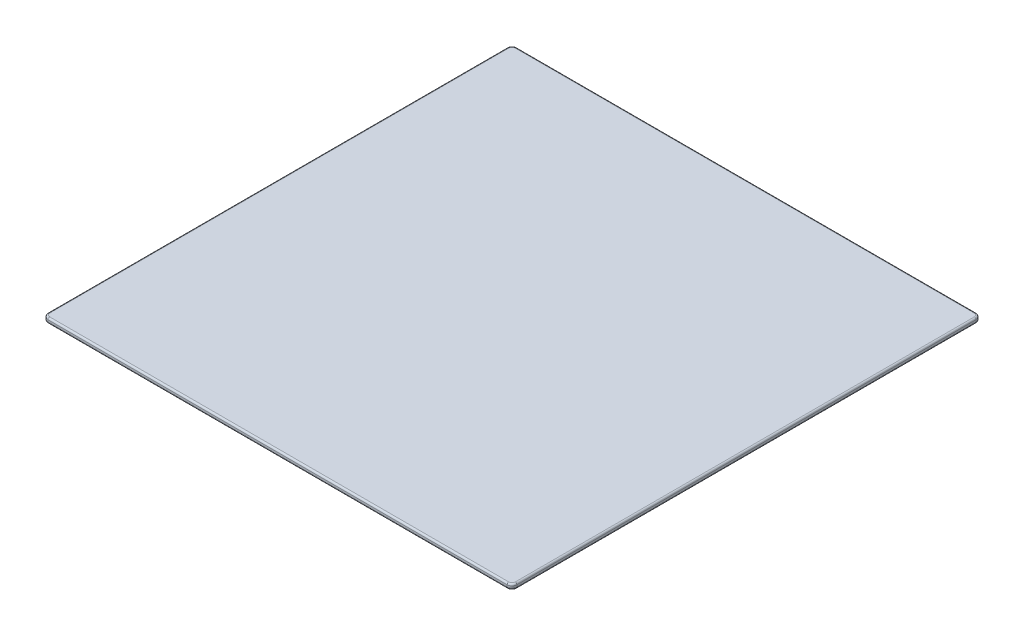
ISO-10303-21;
HEADER;
FILE_DESCRIPTION(('STEP AP214'),'2;1');
FILE_NAME('part.step','',(''),(''),'','','');
FILE_SCHEMA(('AUTOMOTIVE_DESIGN { 1 0 10303 214 1 1 1 1 }'));
ENDSEC;
DATA;
#1=APPLICATION_CONTEXT('core data for automotive mechanical design processes');
#2=APPLICATION_PROTOCOL_DEFINITION('international standard','automotive_design',2000,#1);
#3=PRODUCT_CONTEXT('',#1,'mechanical');
#4=PRODUCT('Part','Part','',(#3));
#5=PRODUCT_RELATED_PRODUCT_CATEGORY('part','',(#4));
#6=PRODUCT_DEFINITION_FORMATION('','',#4);
#7=PRODUCT_DEFINITION_CONTEXT('part definition',#1,'design');
#8=PRODUCT_DEFINITION('design','',#6,#7);
#9=PRODUCT_DEFINITION_SHAPE('','',#8);
#10=(LENGTH_UNIT() NAMED_UNIT(*) SI_UNIT(.MILLI.,.METRE.));
#11=(NAMED_UNIT(*) PLANE_ANGLE_UNIT() SI_UNIT($,.RADIAN.));
#12=(NAMED_UNIT(*) SI_UNIT($,.STERADIAN.) SOLID_ANGLE_UNIT());
#13=UNCERTAINTY_MEASURE_WITH_UNIT(LENGTH_MEASURE(1.E-05),#10,'distance_accuracy_value','');
#14=(GEOMETRIC_REPRESENTATION_CONTEXT(3) GLOBAL_UNCERTAINTY_ASSIGNED_CONTEXT((#13)) GLOBAL_UNIT_ASSIGNED_CONTEXT((#10,
#11,#12)) REPRESENTATION_CONTEXT('',''));
#15=CARTESIAN_POINT('',(0.,0.,0.));
#16=DIRECTION('',(0.,0.,1.));
#17=DIRECTION('',(1.,0.,0.));
#18=AXIS2_PLACEMENT_3D('',#15,#16,#17);
#19=CARTESIAN_POINT('',(142.875,3.175,142.875));
#20=DIRECTION('',(-1.,0.,0.));
#21=DIRECTION('',(0.,0.,1.));
#22=AXIS2_PLACEMENT_3D('',#19,#20,#21);
#23=PLANE('',#22);
#24=DIRECTION('',(0.,-1.,0.));
#25=VECTOR('',#24,1.);
#26=CARTESIAN_POINT('',(142.875,3.175,139.875));
#27=LINE('',#26,#25);
#28=CARTESIAN_POINT('',(142.875,2.175,139.875));
#29=VERTEX_POINT('',#28);
#30=CARTESIAN_POINT('',(142.875,1.,139.875));
#31=VERTEX_POINT('',#30);
#32=EDGE_CURVE('E282',#29,#31,#27,.T.);
#33=ORIENTED_EDGE('',*,*,#32,.T.);
#34=DIRECTION('',(0.,0.,-1.));
#35=VECTOR('',#34,1.);
#36=CARTESIAN_POINT('',(142.875,1.,-139.875));
#37=LINE('',#36,#35);
#38=CARTESIAN_POINT('',(142.875,1.,-139.875));
#39=VERTEX_POINT('',#38);
#40=EDGE_CURVE('E59',#31,#39,#37,.T.);
#41=ORIENTED_EDGE('',*,*,#40,.T.);
#42=DIRECTION('',(0.,-1.,0.));
#43=VECTOR('',#42,1.);
#44=CARTESIAN_POINT('',(142.875,3.175,-139.875));
#45=LINE('',#44,#43);
#46=CARTESIAN_POINT('',(142.875,2.175,-139.875));
#47=VERTEX_POINT('',#46);
#48=EDGE_CURVE('E286',#39,#47,#45,.F.);
#49=ORIENTED_EDGE('',*,*,#48,.T.);
#50=DIRECTION('',(0.,0.,-1.));
#51=VECTOR('',#50,1.);
#52=CARTESIAN_POINT('',(142.875,2.175,142.875));
#53=LINE('',#52,#51);
#54=EDGE_CURVE('E188',#47,#29,#53,.F.);
#55=ORIENTED_EDGE('',*,*,#54,.T.);
#56=EDGE_LOOP('',(#33,#41,#49,#55));
#57=FACE_BOUND('',#56,.T.);
#58=ADVANCED_FACE('F35',(#57),#23,.F.);
#59=CARTESIAN_POINT('',(-142.875,3.175,-142.875));
#60=DIRECTION('',(0.,0.,1.));
#61=DIRECTION('',(1.,0.,0.));
#62=AXIS2_PLACEMENT_3D('',#59,#60,#61);
#63=PLANE('',#62);
#64=DIRECTION('',(0.,-1.,0.));
#65=VECTOR('',#64,1.);
#66=CARTESIAN_POINT('',(139.875,3.175,-142.875));
#67=LINE('',#66,#65);
#68=CARTESIAN_POINT('',(139.875,2.175,-142.875));
#69=VERTEX_POINT('',#68);
#70=CARTESIAN_POINT('',(139.875,1.,-142.875));
#71=VERTEX_POINT('',#70);
#72=EDGE_CURVE('E287',#69,#71,#67,.T.);
#73=ORIENTED_EDGE('',*,*,#72,.T.);
#74=DIRECTION('',(-1.,0.,0.));
#75=VECTOR('',#74,1.);
#76=CARTESIAN_POINT('',(-139.875,1.,-142.875));
#77=LINE('',#76,#75);
#78=CARTESIAN_POINT('',(-139.875,1.,-142.875));
#79=VERTEX_POINT('',#78);
#80=EDGE_CURVE('E11',#71,#79,#77,.T.);
#81=ORIENTED_EDGE('',*,*,#80,.T.);
#82=DIRECTION('',(0.,-1.,0.));
#83=VECTOR('',#82,1.);
#84=CARTESIAN_POINT('',(-139.875,3.175,-142.875));
#85=LINE('',#84,#83);
#86=CARTESIAN_POINT('',(-139.875,2.175,-142.875));
#87=VERTEX_POINT('',#86);
#88=EDGE_CURVE('E218',#79,#87,#85,.F.);
#89=ORIENTED_EDGE('',*,*,#88,.T.);
#90=DIRECTION('',(-1.,0.,0.));
#91=VECTOR('',#90,1.);
#92=CARTESIAN_POINT('',(-142.875,2.175,-142.875));
#93=LINE('',#92,#91);
#94=EDGE_CURVE('E178',#87,#69,#93,.F.);
#95=ORIENTED_EDGE('',*,*,#94,.T.);
#96=EDGE_LOOP('',(#73,#81,#89,#95));
#97=FACE_BOUND('',#96,.T.);
#98=ADVANCED_FACE('F355',(#97),#63,.F.);
#99=CARTESIAN_POINT('',(-142.875,3.175,142.875));
#100=DIRECTION('',(1.,0.,0.));
#101=DIRECTION('',(0.,0.,-1.));
#102=AXIS2_PLACEMENT_3D('',#99,#100,#101);
#103=PLANE('',#102);
#104=DIRECTION('',(0.,-1.,0.));
#105=VECTOR('',#104,1.);
#106=CARTESIAN_POINT('',(-142.875,3.175,-139.875));
#107=LINE('',#106,#105);
#108=CARTESIAN_POINT('',(-142.875,2.175,-139.875));
#109=VERTEX_POINT('',#108);
#110=CARTESIAN_POINT('',(-142.875,1.,-139.875));
#111=VERTEX_POINT('',#110);
#112=EDGE_CURVE('E297',#109,#111,#107,.T.);
#113=ORIENTED_EDGE('',*,*,#112,.T.);
#114=DIRECTION('',(0.,0.,1.));
#115=VECTOR('',#114,1.);
#116=CARTESIAN_POINT('',(-142.875,1.,139.875));
#117=LINE('',#116,#115);
#118=CARTESIAN_POINT('',(-142.875,1.,139.875));
#119=VERTEX_POINT('',#118);
#120=EDGE_CURVE('E238',#111,#119,#117,.T.);
#121=ORIENTED_EDGE('',*,*,#120,.T.);
#122=DIRECTION('',(0.,-1.,0.));
#123=VECTOR('',#122,1.);
#124=CARTESIAN_POINT('',(-142.875,3.175,139.875));
#125=LINE('',#124,#123);
#126=CARTESIAN_POINT('',(-142.875,2.175,139.875));
#127=VERTEX_POINT('',#126);
#128=EDGE_CURVE('E171',#119,#127,#125,.F.);
#129=ORIENTED_EDGE('',*,*,#128,.T.);
#130=DIRECTION('',(0.,0.,1.));
#131=VECTOR('',#130,1.);
#132=CARTESIAN_POINT('',(-142.875,2.175,142.875));
#133=LINE('',#132,#131);
#134=EDGE_CURVE('E198',#127,#109,#133,.F.);
#135=ORIENTED_EDGE('',*,*,#134,.T.);
#136=EDGE_LOOP('',(#113,#121,#129,#135));
#137=FACE_BOUND('',#136,.T.);
#138=ADVANCED_FACE('F324',(#137),#103,.F.);
#139=CARTESIAN_POINT('',(-142.875,3.175,142.875));
#140=DIRECTION('',(0.,0.,-1.));
#141=DIRECTION('',(-1.,0.,0.));
#142=AXIS2_PLACEMENT_3D('',#139,#140,#141);
#143=PLANE('',#142);
#144=DIRECTION('',(0.,-1.,0.));
#145=VECTOR('',#144,1.);
#146=CARTESIAN_POINT('',(-139.875,3.175,142.875));
#147=LINE('',#146,#145);
#148=CARTESIAN_POINT('',(-139.875,2.175,142.875));
#149=VERTEX_POINT('',#148);
#150=CARTESIAN_POINT('',(-139.875,1.,142.875));
#151=VERTEX_POINT('',#150);
#152=EDGE_CURVE('E289',#149,#151,#147,.T.);
#153=ORIENTED_EDGE('',*,*,#152,.T.);
#154=DIRECTION('',(1.,0.,0.));
#155=VECTOR('',#154,1.);
#156=CARTESIAN_POINT('',(139.875,1.,142.875));
#157=LINE('',#156,#155);
#158=CARTESIAN_POINT('',(139.875,1.,142.875));
#159=VERTEX_POINT('',#158);
#160=EDGE_CURVE('E242',#151,#159,#157,.T.);
#161=ORIENTED_EDGE('',*,*,#160,.T.);
#162=DIRECTION('',(0.,-1.,0.));
#163=VECTOR('',#162,1.);
#164=CARTESIAN_POINT('',(139.875,3.175,142.875));
#165=LINE('',#164,#163);
#166=CARTESIAN_POINT('',(139.875,2.175,142.875));
#167=VERTEX_POINT('',#166);
#168=EDGE_CURVE('E284',#159,#167,#165,.F.);
#169=ORIENTED_EDGE('',*,*,#168,.T.);
#170=DIRECTION('',(1.,0.,0.));
#171=VECTOR('',#170,1.);
#172=CARTESIAN_POINT('',(-142.875,2.175,142.875));
#173=LINE('',#172,#171);
#174=EDGE_CURVE('E193',#167,#149,#173,.F.);
#175=ORIENTED_EDGE('',*,*,#174,.T.);
#176=EDGE_LOOP('',(#153,#161,#169,#175));
#177=FACE_BOUND('',#176,.T.);
#178=ADVANCED_FACE('F551',(#177),#143,.F.);
#179=CARTESIAN_POINT('',(0.,3.175,0.));
#180=DIRECTION('',(0.,-1.,0.));
#181=DIRECTION('',(0.,0.,-1.));
#182=AXIS2_PLACEMENT_3D('',#179,#180,#181);
#183=PLANE('',#182);
#184=DIRECTION('',(-1.,0.,0.));
#185=VECTOR('',#184,1.);
#186=CARTESIAN_POINT('',(0.,3.175,-141.875));
#187=LINE('',#186,#185);
#188=CARTESIAN_POINT('',(139.875,3.175,-141.875));
#189=VERTEX_POINT('',#188);
#190=CARTESIAN_POINT('',(-139.875,3.175,-141.875));
#191=VERTEX_POINT('',#190);
#192=EDGE_CURVE('E175',#189,#191,#187,.T.);
#193=ORIENTED_EDGE('',*,*,#192,.T.);
#194=CARTESIAN_POINT('',(-139.875,3.175,-139.875));
#195=DIRECTION('',(0.,-1.,0.));
#196=DIRECTION('',(0.,0.,-1.));
#197=AXIS2_PLACEMENT_3D('',#194,#195,#196);
#198=CIRCLE('',#197,2.);
#199=CARTESIAN_POINT('',(-141.875,3.175,-139.875));
#200=VERTEX_POINT('',#199);
#201=EDGE_CURVE('E156',#191,#200,#198,.F.);
#202=ORIENTED_EDGE('',*,*,#201,.T.);
#203=DIRECTION('',(0.,0.,1.));
#204=VECTOR('',#203,1.);
#205=CARTESIAN_POINT('',(-141.875,3.175,0.));
#206=LINE('',#205,#204);
#207=CARTESIAN_POINT('',(-141.875,3.175,139.875));
#208=VERTEX_POINT('',#207);
#209=EDGE_CURVE('E164',#200,#208,#206,.T.);
#210=ORIENTED_EDGE('',*,*,#209,.T.);
#211=CARTESIAN_POINT('',(-139.875,3.175,139.875));
#212=DIRECTION('',(0.,-1.,0.));
#213=DIRECTION('',(0.,0.,-1.));
#214=AXIS2_PLACEMENT_3D('',#211,#212,#213);
#215=CIRCLE('',#214,2.);
#216=CARTESIAN_POINT('',(-139.875,3.175,141.875));
#217=VERTEX_POINT('',#216);
#218=EDGE_CURVE('E170',#208,#217,#215,.F.);
#219=ORIENTED_EDGE('',*,*,#218,.T.);
#220=DIRECTION('',(1.,0.,0.));
#221=VECTOR('',#220,1.);
#222=CARTESIAN_POINT('',(0.,3.175,141.875));
#223=LINE('',#222,#221);
#224=CARTESIAN_POINT('',(139.875,3.175,141.875));
#225=VERTEX_POINT('',#224);
#226=EDGE_CURVE('E302',#217,#225,#223,.T.);
#227=ORIENTED_EDGE('',*,*,#226,.T.);
#228=CARTESIAN_POINT('',(139.875,3.175,139.875));
#229=DIRECTION('',(0.,-1.,0.));
#230=DIRECTION('',(0.,0.,-1.));
#231=AXIS2_PLACEMENT_3D('',#228,#229,#230);
#232=CIRCLE('',#231,2.);
#233=CARTESIAN_POINT('',(141.875,3.175,139.875));
#234=VERTEX_POINT('',#233);
#235=EDGE_CURVE('E304',#225,#234,#232,.F.);
#236=ORIENTED_EDGE('',*,*,#235,.T.);
#237=DIRECTION('',(0.,0.,-1.));
#238=VECTOR('',#237,1.);
#239=CARTESIAN_POINT('',(141.875,3.175,0.));
#240=LINE('',#239,#238);
#241=CARTESIAN_POINT('',(141.875,3.175,-139.875));
#242=VERTEX_POINT('',#241);
#243=EDGE_CURVE('E306',#234,#242,#240,.T.);
#244=ORIENTED_EDGE('',*,*,#243,.T.);
#245=CARTESIAN_POINT('',(139.875,3.175,-139.875));
#246=DIRECTION('',(0.,-1.,0.));
#247=DIRECTION('',(0.,0.,-1.));
#248=AXIS2_PLACEMENT_3D('',#245,#246,#247);
#249=CIRCLE('',#248,2.);
#250=EDGE_CURVE('E180',#242,#189,#249,.F.);
#251=ORIENTED_EDGE('',*,*,#250,.T.);
#252=EDGE_LOOP('',(#193,#202,#210,#219,#227,#236,#244,#251));
#253=FACE_BOUND('',#252,.T.);
#254=ADVANCED_FACE('F173',(#253),#183,.F.);
#255=CARTESIAN_POINT('',(0.,0.,0.));
#256=DIRECTION('',(0.,-1.,0.));
#257=DIRECTION('',(0.,0.,-1.));
#258=AXIS2_PLACEMENT_3D('',#255,#256,#257);
#259=PLANE('',#258);
#260=DIRECTION('',(0.,0.,1.));
#261=VECTOR('',#260,1.);
#262=CARTESIAN_POINT('',(-141.875,0.,-139.875));
#263=LINE('',#262,#261);
#264=CARTESIAN_POINT('',(-141.875,0.,139.875));
#265=VERTEX_POINT('',#264);
#266=CARTESIAN_POINT('',(-141.875,0.,-139.875));
#267=VERTEX_POINT('',#266);
#268=EDGE_CURVE('E230',#265,#267,#263,.F.);
#269=ORIENTED_EDGE('',*,*,#268,.T.);
#270=CARTESIAN_POINT('',(-139.875,0.,-139.875));
#271=DIRECTION('',(0.,-1.,0.));
#272=DIRECTION('',(0.,0.,-1.));
#273=AXIS2_PLACEMENT_3D('',#270,#271,#272);
#274=CIRCLE('',#273,2.);
#275=CARTESIAN_POINT('',(-139.875,0.,-141.875));
#276=VERTEX_POINT('',#275);
#277=EDGE_CURVE('E232',#267,#276,#274,.T.);
#278=ORIENTED_EDGE('',*,*,#277,.T.);
#279=DIRECTION('',(-1.,0.,0.));
#280=VECTOR('',#279,1.);
#281=CARTESIAN_POINT('',(139.875,0.,-141.875));
#282=LINE('',#281,#280);
#283=CARTESIAN_POINT('',(139.875,0.,-141.875));
#284=VERTEX_POINT('',#283);
#285=EDGE_CURVE('E199',#276,#284,#282,.F.);
#286=ORIENTED_EDGE('',*,*,#285,.T.);
#287=CARTESIAN_POINT('',(139.875,0.,-139.875));
#288=DIRECTION('',(0.,-1.,0.));
#289=DIRECTION('',(0.,0.,-1.));
#290=AXIS2_PLACEMENT_3D('',#287,#288,#289);
#291=CIRCLE('',#290,2.);
#292=CARTESIAN_POINT('',(141.875,0.,-139.875));
#293=VERTEX_POINT('',#292);
#294=EDGE_CURVE('E220',#284,#293,#291,.T.);
#295=ORIENTED_EDGE('',*,*,#294,.T.);
#296=DIRECTION('',(0.,0.,-1.));
#297=VECTOR('',#296,1.);
#298=CARTESIAN_POINT('',(141.875,0.,139.875));
#299=LINE('',#298,#297);
#300=CARTESIAN_POINT('',(141.875,0.,139.875));
#301=VERTEX_POINT('',#300);
#302=EDGE_CURVE('E222',#293,#301,#299,.F.);
#303=ORIENTED_EDGE('',*,*,#302,.T.);
#304=CARTESIAN_POINT('',(139.875,0.,139.875));
#305=DIRECTION('',(0.,-1.,0.));
#306=DIRECTION('',(0.,0.,-1.));
#307=AXIS2_PLACEMENT_3D('',#304,#305,#306);
#308=CIRCLE('',#307,2.);
#309=CARTESIAN_POINT('',(139.875,0.,141.875));
#310=VERTEX_POINT('',#309);
#311=EDGE_CURVE('E224',#301,#310,#308,.T.);
#312=ORIENTED_EDGE('',*,*,#311,.T.);
#313=DIRECTION('',(1.,0.,0.));
#314=VECTOR('',#313,1.);
#315=CARTESIAN_POINT('',(-139.875,0.,141.875));
#316=LINE('',#315,#314);
#317=CARTESIAN_POINT('',(-139.875,0.,141.875));
#318=VERTEX_POINT('',#317);
#319=EDGE_CURVE('E226',#310,#318,#316,.F.);
#320=ORIENTED_EDGE('',*,*,#319,.T.);
#321=CARTESIAN_POINT('',(-139.875,0.,139.875));
#322=DIRECTION('',(0.,-1.,0.));
#323=DIRECTION('',(0.,0.,-1.));
#324=AXIS2_PLACEMENT_3D('',#321,#322,#323);
#325=CIRCLE('',#324,2.);
#326=EDGE_CURVE('E228',#318,#265,#325,.T.);
#327=ORIENTED_EDGE('',*,*,#326,.T.);
#328=EDGE_LOOP('',(#269,#278,#286,#295,#303,#312,#320,#327));
#329=FACE_BOUND('',#328,.T.);
#330=ADVANCED_FACE('F366',(#329),#259,.T.);
#331=CARTESIAN_POINT('',(139.875,3.175,-139.875));
#332=DIRECTION('',(0.,-1.,0.));
#333=DIRECTION('',(0.,0.,-1.));
#334=AXIS2_PLACEMENT_3D('',#331,#332,#333);
#335=CYLINDRICAL_SURFACE('',#334,3.);
#336=ORIENTED_EDGE('',*,*,#48,.F.);
#337=CARTESIAN_POINT('',(139.875,1.,-139.875));
#338=DIRECTION('',(0.,-1.,0.));
#339=DIRECTION('',(0.,0.,-1.));
#340=AXIS2_PLACEMENT_3D('',#337,#338,#339);
#341=CIRCLE('',#340,3.);
#342=EDGE_CURVE('E44',#39,#71,#341,.F.);
#343=ORIENTED_EDGE('',*,*,#342,.T.);
#344=ORIENTED_EDGE('',*,*,#72,.F.);
#345=CARTESIAN_POINT('',(139.875,2.175,-139.875));
#346=DIRECTION('',(0.,-1.,0.));
#347=DIRECTION('',(0.,0.,-1.));
#348=AXIS2_PLACEMENT_3D('',#345,#346,#347);
#349=CIRCLE('',#348,3.);
#350=EDGE_CURVE('E185',#69,#47,#349,.T.);
#351=ORIENTED_EDGE('',*,*,#350,.T.);
#352=EDGE_LOOP('',(#336,#343,#344,#351));
#353=FACE_BOUND('',#352,.T.);
#354=ADVANCED_FACE('F363',(#353),#335,.T.);
#355=CARTESIAN_POINT('',(139.875,3.175,139.875));
#356=DIRECTION('',(0.,-1.,0.));
#357=DIRECTION('',(0.,0.,-1.));
#358=AXIS2_PLACEMENT_3D('',#355,#356,#357);
#359=CYLINDRICAL_SURFACE('',#358,3.);
#360=ORIENTED_EDGE('',*,*,#168,.F.);
#361=CARTESIAN_POINT('',(139.875,1.,139.875));
#362=DIRECTION('',(0.,-1.,0.));
#363=DIRECTION('',(0.,0.,-1.));
#364=AXIS2_PLACEMENT_3D('',#361,#362,#363);
#365=CIRCLE('',#364,3.);
#366=EDGE_CURVE('E244',#159,#31,#365,.F.);
#367=ORIENTED_EDGE('',*,*,#366,.T.);
#368=ORIENTED_EDGE('',*,*,#32,.F.);
#369=CARTESIAN_POINT('',(139.875,2.175,139.875));
#370=DIRECTION('',(0.,-1.,0.));
#371=DIRECTION('',(0.,0.,-1.));
#372=AXIS2_PLACEMENT_3D('',#369,#370,#371);
#373=CIRCLE('',#372,3.);
#374=EDGE_CURVE('E190',#29,#167,#373,.T.);
#375=ORIENTED_EDGE('',*,*,#374,.T.);
#376=EDGE_LOOP('',(#360,#367,#368,#375));
#377=FACE_BOUND('',#376,.T.);
#378=ADVANCED_FACE('F281',(#377),#359,.T.);
#379=CARTESIAN_POINT('',(-139.875,3.175,139.875));
#380=DIRECTION('',(0.,-1.,0.));
#381=DIRECTION('',(0.,0.,-1.));
#382=AXIS2_PLACEMENT_3D('',#379,#380,#381);
#383=CYLINDRICAL_SURFACE('',#382,3.);
#384=ORIENTED_EDGE('',*,*,#128,.F.);
#385=CARTESIAN_POINT('',(-139.875,1.,139.875));
#386=DIRECTION('',(0.,-1.,0.));
#387=DIRECTION('',(0.,0.,-1.));
#388=AXIS2_PLACEMENT_3D('',#385,#386,#387);
#389=CIRCLE('',#388,3.);
#390=EDGE_CURVE('E240',#119,#151,#389,.F.);
#391=ORIENTED_EDGE('',*,*,#390,.T.);
#392=ORIENTED_EDGE('',*,*,#152,.F.);
#393=CARTESIAN_POINT('',(-139.875,2.175,139.875));
#394=DIRECTION('',(0.,-1.,0.));
#395=DIRECTION('',(0.,0.,-1.));
#396=AXIS2_PLACEMENT_3D('',#393,#394,#395);
#397=CIRCLE('',#396,3.);
#398=EDGE_CURVE('E195',#149,#127,#397,.T.);
#399=ORIENTED_EDGE('',*,*,#398,.T.);
#400=EDGE_LOOP('',(#384,#391,#392,#399));
#401=FACE_BOUND('',#400,.T.);
#402=ADVANCED_FACE('F331',(#401),#383,.T.);
#403=CARTESIAN_POINT('',(-139.875,3.175,-139.875));
#404=DIRECTION('',(0.,-1.,0.));
#405=DIRECTION('',(0.,0.,-1.));
#406=AXIS2_PLACEMENT_3D('',#403,#404,#405);
#407=CYLINDRICAL_SURFACE('',#406,3.);
#408=ORIENTED_EDGE('',*,*,#88,.F.);
#409=CARTESIAN_POINT('',(-139.875,1.,-139.875));
#410=DIRECTION('',(0.,-1.,0.));
#411=DIRECTION('',(0.,0.,-1.));
#412=AXIS2_PLACEMENT_3D('',#409,#410,#411);
#413=CIRCLE('',#412,3.);
#414=EDGE_CURVE('E235',#79,#111,#413,.F.);
#415=ORIENTED_EDGE('',*,*,#414,.T.);
#416=ORIENTED_EDGE('',*,*,#112,.F.);
#417=CARTESIAN_POINT('',(-139.875,2.175,-139.875));
#418=DIRECTION('',(0.,-1.,0.));
#419=DIRECTION('',(0.,0.,-1.));
#420=AXIS2_PLACEMENT_3D('',#417,#418,#419);
#421=CIRCLE('',#420,3.);
#422=EDGE_CURVE('E158',#109,#87,#421,.T.);
#423=ORIENTED_EDGE('',*,*,#422,.T.);
#424=EDGE_LOOP('',(#408,#415,#416,#423));
#425=FACE_BOUND('',#424,.T.);
#426=ADVANCED_FACE('F321',(#425),#407,.T.);
#427=CARTESIAN_POINT('',(139.875,2.175,139.875));
#428=DIRECTION('',(0.,-1.,0.));
#429=DIRECTION('',(0.,0.,-1.));
#430=AXIS2_PLACEMENT_3D('',#427,#428,#429);
#431=TOROIDAL_SURFACE('',#430,2.,1.);
#432=CARTESIAN_POINT('',(139.875,2.175,141.875));
#433=DIRECTION('',(-1.,0.,0.));
#434=DIRECTION('',(0.,0.,1.));
#435=AXIS2_PLACEMENT_3D('',#432,#433,#434);
#436=CIRCLE('',#435,1.);
#437=EDGE_CURVE('E212',#167,#225,#436,.T.);
#438=ORIENTED_EDGE('',*,*,#437,.F.);
#439=ORIENTED_EDGE('',*,*,#374,.F.);
#440=CARTESIAN_POINT('',(141.875,2.175,139.875));
#441=DIRECTION('',(0.,0.,-1.));
#442=DIRECTION('',(-1.,0.,0.));
#443=AXIS2_PLACEMENT_3D('',#440,#441,#442);
#444=CIRCLE('',#443,1.);
#445=EDGE_CURVE('E215',#234,#29,#444,.T.);
#446=ORIENTED_EDGE('',*,*,#445,.F.);
#447=ORIENTED_EDGE('',*,*,#235,.F.);
#448=EDGE_LOOP('',(#438,#439,#446,#447));
#449=FACE_BOUND('',#448,.T.);
#450=ADVANCED_FACE('F342',(#449),#431,.T.);
#451=CARTESIAN_POINT('',(141.875,2.175,0.));
#452=DIRECTION('',(0.,0.,-1.));
#453=DIRECTION('',(-1.,0.,0.));
#454=AXIS2_PLACEMENT_3D('',#451,#452,#453);
#455=CYLINDRICAL_SURFACE('',#454,1.);
#456=ORIENTED_EDGE('',*,*,#445,.T.);
#457=ORIENTED_EDGE('',*,*,#54,.F.);
#458=CARTESIAN_POINT('',(141.875,2.175,-139.875));
#459=DIRECTION('',(0.,0.,-1.));
#460=DIRECTION('',(-1.,0.,0.));
#461=AXIS2_PLACEMENT_3D('',#458,#459,#460);
#462=CIRCLE('',#461,1.);
#463=EDGE_CURVE('E209',#242,#47,#462,.T.);
#464=ORIENTED_EDGE('',*,*,#463,.F.);
#465=ORIENTED_EDGE('',*,*,#243,.F.);
#466=EDGE_LOOP('',(#456,#457,#464,#465));
#467=FACE_BOUND('',#466,.T.);
#468=ADVANCED_FACE('F345',(#467),#455,.T.);
#469=CARTESIAN_POINT('',(0.,2.175,141.875));
#470=DIRECTION('',(1.,0.,0.));
#471=DIRECTION('',(0.,0.,-1.));
#472=AXIS2_PLACEMENT_3D('',#469,#470,#471);
#473=CYLINDRICAL_SURFACE('',#472,1.);
#474=ORIENTED_EDGE('',*,*,#437,.T.);
#475=ORIENTED_EDGE('',*,*,#226,.F.);
#476=CARTESIAN_POINT('',(-139.875,2.175,141.875));
#477=DIRECTION('',(-1.,0.,0.));
#478=DIRECTION('',(0.,0.,1.));
#479=AXIS2_PLACEMENT_3D('',#476,#477,#478);
#480=CIRCLE('',#479,1.);
#481=EDGE_CURVE('E206',#149,#217,#480,.T.);
#482=ORIENTED_EDGE('',*,*,#481,.F.);
#483=ORIENTED_EDGE('',*,*,#174,.F.);
#484=EDGE_LOOP('',(#474,#475,#482,#483));
#485=FACE_BOUND('',#484,.T.);
#486=ADVANCED_FACE('F338',(#485),#473,.T.);
#487=CARTESIAN_POINT('',(139.875,2.175,-139.875));
#488=DIRECTION('',(0.,-1.,0.));
#489=DIRECTION('',(0.,0.,-1.));
#490=AXIS2_PLACEMENT_3D('',#487,#488,#489);
#491=TOROIDAL_SURFACE('',#490,2.,1.);
#492=ORIENTED_EDGE('',*,*,#463,.T.);
#493=ORIENTED_EDGE('',*,*,#350,.F.);
#494=CARTESIAN_POINT('',(139.875,2.175,-141.875));
#495=DIRECTION('',(-1.,0.,0.));
#496=DIRECTION('',(0.,0.,1.));
#497=AXIS2_PLACEMENT_3D('',#494,#495,#496);
#498=CIRCLE('',#497,1.);
#499=EDGE_CURVE('E203',#189,#69,#498,.T.);
#500=ORIENTED_EDGE('',*,*,#499,.F.);
#501=ORIENTED_EDGE('',*,*,#250,.F.);
#502=EDGE_LOOP('',(#492,#493,#500,#501));
#503=FACE_BOUND('',#502,.T.);
#504=ADVANCED_FACE('F313',(#503),#491,.T.);
#505=CARTESIAN_POINT('',(-139.875,2.175,139.875));
#506=DIRECTION('',(0.,-1.,0.));
#507=DIRECTION('',(0.,0.,-1.));
#508=AXIS2_PLACEMENT_3D('',#505,#506,#507);
#509=TOROIDAL_SURFACE('',#508,2.,1.);
#510=ORIENTED_EDGE('',*,*,#481,.T.);
#511=ORIENTED_EDGE('',*,*,#218,.F.);
#512=CARTESIAN_POINT('',(-141.875,2.175,139.875));
#513=DIRECTION('',(0.,0.,-1.));
#514=DIRECTION('',(-1.,0.,0.));
#515=AXIS2_PLACEMENT_3D('',#512,#513,#514);
#516=CIRCLE('',#515,1.);
#517=EDGE_CURVE('E167',#127,#208,#516,.T.);
#518=ORIENTED_EDGE('',*,*,#517,.F.);
#519=ORIENTED_EDGE('',*,*,#398,.F.);
#520=EDGE_LOOP('',(#510,#511,#518,#519));
#521=FACE_BOUND('',#520,.T.);
#522=ADVANCED_FACE('F334',(#521),#509,.T.);
#523=CARTESIAN_POINT('',(0.,2.175,-141.875));
#524=DIRECTION('',(-1.,0.,0.));
#525=DIRECTION('',(0.,0.,1.));
#526=AXIS2_PLACEMENT_3D('',#523,#524,#525);
#527=CYLINDRICAL_SURFACE('',#526,1.);
#528=ORIENTED_EDGE('',*,*,#499,.T.);
#529=ORIENTED_EDGE('',*,*,#94,.F.);
#530=CARTESIAN_POINT('',(-139.875,2.175,-141.875));
#531=DIRECTION('',(-1.,0.,0.));
#532=DIRECTION('',(0.,0.,1.));
#533=AXIS2_PLACEMENT_3D('',#530,#531,#532);
#534=CIRCLE('',#533,1.);
#535=EDGE_CURVE('E161',#191,#87,#534,.T.);
#536=ORIENTED_EDGE('',*,*,#535,.F.);
#537=ORIENTED_EDGE('',*,*,#192,.F.);
#538=EDGE_LOOP('',(#528,#529,#536,#537));
#539=FACE_BOUND('',#538,.T.);
#540=ADVANCED_FACE('F316',(#539),#527,.T.);
#541=CARTESIAN_POINT('',(-141.875,2.175,0.));
#542=DIRECTION('',(0.,0.,1.));
#543=DIRECTION('',(1.,0.,0.));
#544=AXIS2_PLACEMENT_3D('',#541,#542,#543);
#545=CYLINDRICAL_SURFACE('',#544,1.);
#546=ORIENTED_EDGE('',*,*,#517,.T.);
#547=ORIENTED_EDGE('',*,*,#209,.F.);
#548=CARTESIAN_POINT('',(-141.875,2.175,-139.875));
#549=DIRECTION('',(0.,0.,-1.));
#550=DIRECTION('',(-1.,0.,0.));
#551=AXIS2_PLACEMENT_3D('',#548,#549,#550);
#552=CIRCLE('',#551,1.);
#553=EDGE_CURVE('E151',#109,#200,#552,.T.);
#554=ORIENTED_EDGE('',*,*,#553,.F.);
#555=ORIENTED_EDGE('',*,*,#134,.F.);
#556=EDGE_LOOP('',(#546,#547,#554,#555));
#557=FACE_BOUND('',#556,.T.);
#558=ADVANCED_FACE('F165',(#557),#545,.T.);
#559=CARTESIAN_POINT('',(-139.875,2.175,-139.875));
#560=DIRECTION('',(0.,-1.,0.));
#561=DIRECTION('',(0.,0.,-1.));
#562=AXIS2_PLACEMENT_3D('',#559,#560,#561);
#563=TOROIDAL_SURFACE('',#562,2.,1.);
#564=ORIENTED_EDGE('',*,*,#535,.T.);
#565=ORIENTED_EDGE('',*,*,#422,.F.);
#566=ORIENTED_EDGE('',*,*,#553,.T.);
#567=ORIENTED_EDGE('',*,*,#201,.F.);
#568=EDGE_LOOP('',(#564,#565,#566,#567));
#569=FACE_BOUND('',#568,.T.);
#570=ADVANCED_FACE('F154',(#569),#563,.T.);
#571=CARTESIAN_POINT('',(139.875,1.,139.875));
#572=DIRECTION('',(0.,-1.,0.));
#573=DIRECTION('',(0.,0.,-1.));
#574=AXIS2_PLACEMENT_3D('',#571,#572,#573);
#575=TOROIDAL_SURFACE('',#574,2.,1.);
#576=CARTESIAN_POINT('',(141.875,1.,139.875));
#577=DIRECTION('',(0.,0.,-1.));
#578=DIRECTION('',(-1.,0.,0.));
#579=AXIS2_PLACEMENT_3D('',#576,#577,#578);
#580=CIRCLE('',#579,1.);
#581=EDGE_CURVE('E263',#31,#301,#580,.T.);
#582=ORIENTED_EDGE('',*,*,#581,.F.);
#583=ORIENTED_EDGE('',*,*,#366,.F.);
#584=CARTESIAN_POINT('',(139.875,1.,141.875));
#585=DIRECTION('',(-1.,0.,0.));
#586=DIRECTION('',(0.,0.,1.));
#587=AXIS2_PLACEMENT_3D('',#584,#585,#586);
#588=CIRCLE('',#587,1.);
#589=EDGE_CURVE('E39',#310,#159,#588,.T.);
#590=ORIENTED_EDGE('',*,*,#589,.F.);
#591=ORIENTED_EDGE('',*,*,#311,.F.);
#592=EDGE_LOOP('',(#582,#583,#590,#591));
#593=FACE_BOUND('',#592,.T.);
#594=ADVANCED_FACE('F37',(#593),#575,.T.);
#595=CARTESIAN_POINT('',(-142.875,1.,141.875));
#596=DIRECTION('',(-1.,0.,0.));
#597=DIRECTION('',(0.,0.,1.));
#598=AXIS2_PLACEMENT_3D('',#595,#596,#597);
#599=CYLINDRICAL_SURFACE('',#598,1.);
#600=ORIENTED_EDGE('',*,*,#589,.T.);
#601=ORIENTED_EDGE('',*,*,#160,.F.);
#602=CARTESIAN_POINT('',(-139.875,1.,141.875));
#603=DIRECTION('',(-1.,0.,0.));
#604=DIRECTION('',(0.,0.,1.));
#605=AXIS2_PLACEMENT_3D('',#602,#603,#604);
#606=CIRCLE('',#605,1.);
#607=EDGE_CURVE('E261',#318,#151,#606,.T.);
#608=ORIENTED_EDGE('',*,*,#607,.F.);
#609=ORIENTED_EDGE('',*,*,#319,.F.);
#610=EDGE_LOOP('',(#600,#601,#608,#609));
#611=FACE_BOUND('',#610,.T.);
#612=ADVANCED_FACE('F273',(#611),#599,.T.);
#613=CARTESIAN_POINT('',(141.875,1.,142.875));
#614=DIRECTION('',(0.,0.,1.));
#615=DIRECTION('',(1.,0.,0.));
#616=AXIS2_PLACEMENT_3D('',#613,#614,#615);
#617=CYLINDRICAL_SURFACE('',#616,1.);
#618=ORIENTED_EDGE('',*,*,#581,.T.);
#619=ORIENTED_EDGE('',*,*,#302,.F.);
#620=CARTESIAN_POINT('',(141.875,1.,-139.875));
#621=DIRECTION('',(0.,0.,-1.));
#622=DIRECTION('',(-1.,0.,0.));
#623=AXIS2_PLACEMENT_3D('',#620,#621,#622);
#624=CIRCLE('',#623,1.);
#625=EDGE_CURVE('E258',#39,#293,#624,.T.);
#626=ORIENTED_EDGE('',*,*,#625,.F.);
#627=ORIENTED_EDGE('',*,*,#40,.F.);
#628=EDGE_LOOP('',(#618,#619,#626,#627));
#629=FACE_BOUND('',#628,.T.);
#630=ADVANCED_FACE('F414',(#629),#617,.T.);
#631=CARTESIAN_POINT('',(-139.875,1.,139.875));
#632=DIRECTION('',(0.,-1.,0.));
#633=DIRECTION('',(0.,0.,-1.));
#634=AXIS2_PLACEMENT_3D('',#631,#632,#633);
#635=TOROIDAL_SURFACE('',#634,2.,1.);
#636=ORIENTED_EDGE('',*,*,#607,.T.);
#637=ORIENTED_EDGE('',*,*,#390,.F.);
#638=CARTESIAN_POINT('',(-141.875,1.,139.875));
#639=DIRECTION('',(0.,0.,-1.));
#640=DIRECTION('',(-1.,0.,0.));
#641=AXIS2_PLACEMENT_3D('',#638,#639,#640);
#642=CIRCLE('',#641,1.);
#643=EDGE_CURVE('E255',#265,#119,#642,.T.);
#644=ORIENTED_EDGE('',*,*,#643,.F.);
#645=ORIENTED_EDGE('',*,*,#326,.F.);
#646=EDGE_LOOP('',(#636,#637,#644,#645));
#647=FACE_BOUND('',#646,.T.);
#648=ADVANCED_FACE('F420',(#647),#635,.T.);
#649=CARTESIAN_POINT('',(139.875,1.,-139.875));
#650=DIRECTION('',(0.,-1.,0.));
#651=DIRECTION('',(0.,0.,-1.));
#652=AXIS2_PLACEMENT_3D('',#649,#650,#651);
#653=TOROIDAL_SURFACE('',#652,2.,1.);
#654=ORIENTED_EDGE('',*,*,#625,.T.);
#655=ORIENTED_EDGE('',*,*,#294,.F.);
#656=CARTESIAN_POINT('',(139.875,1.,-141.875));
#657=DIRECTION('',(-1.,0.,0.));
#658=DIRECTION('',(0.,0.,1.));
#659=AXIS2_PLACEMENT_3D('',#656,#657,#658);
#660=CIRCLE('',#659,1.);
#661=EDGE_CURVE('E252',#71,#284,#660,.T.);
#662=ORIENTED_EDGE('',*,*,#661,.F.);
#663=ORIENTED_EDGE('',*,*,#342,.F.);
#664=EDGE_LOOP('',(#654,#655,#662,#663));
#665=FACE_BOUND('',#664,.T.);
#666=ADVANCED_FACE('F427',(#665),#653,.T.);
#667=CARTESIAN_POINT('',(-141.875,1.,142.875));
#668=DIRECTION('',(0.,0.,-1.));
#669=DIRECTION('',(-1.,0.,0.));
#670=AXIS2_PLACEMENT_3D('',#667,#668,#669);
#671=CYLINDRICAL_SURFACE('',#670,1.);
#672=ORIENTED_EDGE('',*,*,#643,.T.);
#673=ORIENTED_EDGE('',*,*,#120,.F.);
#674=CARTESIAN_POINT('',(-141.875,1.,-139.875));
#675=DIRECTION('',(0.,0.,-1.));
#676=DIRECTION('',(-1.,0.,0.));
#677=AXIS2_PLACEMENT_3D('',#674,#675,#676);
#678=CIRCLE('',#677,1.);
#679=EDGE_CURVE('E250',#267,#111,#678,.T.);
#680=ORIENTED_EDGE('',*,*,#679,.F.);
#681=ORIENTED_EDGE('',*,*,#268,.F.);
#682=EDGE_LOOP('',(#672,#673,#680,#681));
#683=FACE_BOUND('',#682,.T.);
#684=ADVANCED_FACE('F435',(#683),#671,.T.);
#685=CARTESIAN_POINT('',(-142.875,1.,-141.875));
#686=DIRECTION('',(1.,0.,0.));
#687=DIRECTION('',(0.,0.,-1.));
#688=AXIS2_PLACEMENT_3D('',#685,#686,#687);
#689=CYLINDRICAL_SURFACE('',#688,1.);
#690=ORIENTED_EDGE('',*,*,#661,.T.);
#691=ORIENTED_EDGE('',*,*,#285,.F.);
#692=CARTESIAN_POINT('',(-139.875,1.,-141.875));
#693=DIRECTION('',(-1.,0.,0.));
#694=DIRECTION('',(0.,0.,1.));
#695=AXIS2_PLACEMENT_3D('',#692,#693,#694);
#696=CIRCLE('',#695,1.);
#697=EDGE_CURVE('E248',#79,#276,#696,.T.);
#698=ORIENTED_EDGE('',*,*,#697,.F.);
#699=ORIENTED_EDGE('',*,*,#80,.F.);
#700=EDGE_LOOP('',(#690,#691,#698,#699));
#701=FACE_BOUND('',#700,.T.);
#702=ADVANCED_FACE('F443',(#701),#689,.T.);
#703=CARTESIAN_POINT('',(-139.875,1.,-139.875));
#704=DIRECTION('',(0.,-1.,0.));
#705=DIRECTION('',(0.,0.,-1.));
#706=AXIS2_PLACEMENT_3D('',#703,#704,#705);
#707=TOROIDAL_SURFACE('',#706,2.,1.);
#708=ORIENTED_EDGE('',*,*,#679,.T.);
#709=ORIENTED_EDGE('',*,*,#414,.F.);
#710=ORIENTED_EDGE('',*,*,#697,.T.);
#711=ORIENTED_EDGE('',*,*,#277,.F.);
#712=EDGE_LOOP('',(#708,#709,#710,#711));
#713=FACE_BOUND('',#712,.T.);
#714=ADVANCED_FACE('F451',(#713),#707,.T.);
#715=CLOSED_SHELL('',(#58,#98,#138,#178,#254,#330,#354,#378,#402,#426,#450,#468,#486,#504,#522,
#540,#558,#570,#594,#612,#630,#648,#666,#684,#702,#714));
#716=MANIFOLD_SOLID_BREP('B2',#715);
#717=ADVANCED_BREP_SHAPE_REPRESENTATION('',(#18,#716),#14);
#718=SHAPE_DEFINITION_REPRESENTATION(#9,#717);
ENDSEC;
END-ISO-10303-21;
